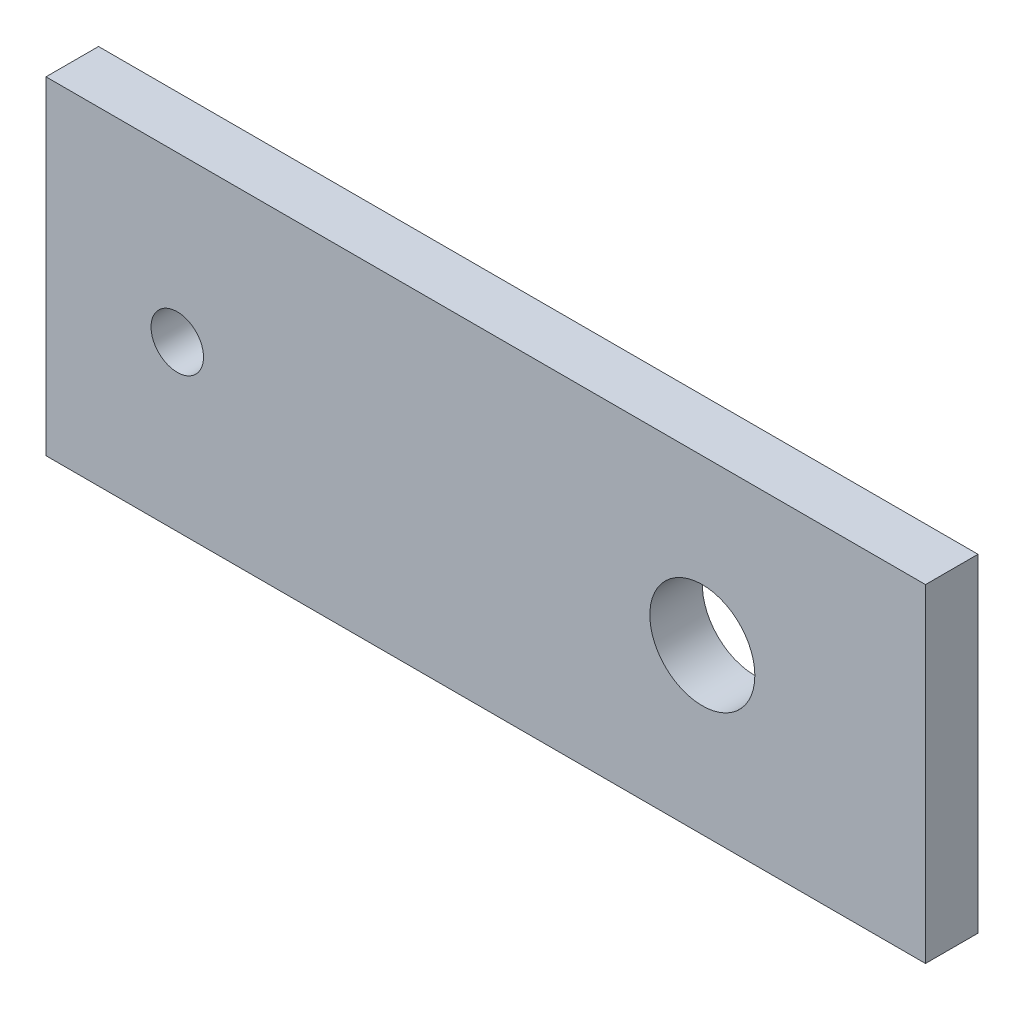
ISO-10303-21;
HEADER;
FILE_DESCRIPTION(('STEP AP214'),'2;1');
FILE_NAME('part.step','',(''),(''),'','','');
FILE_SCHEMA(('AUTOMOTIVE_DESIGN { 1 0 10303 214 1 1 1 1 }'));
ENDSEC;
DATA;
#1=APPLICATION_CONTEXT('core data for automotive mechanical design processes');
#2=APPLICATION_PROTOCOL_DEFINITION('international standard','automotive_design',2000,#1);
#3=PRODUCT_CONTEXT('',#1,'mechanical');
#4=PRODUCT('Part','Part','',(#3));
#5=PRODUCT_RELATED_PRODUCT_CATEGORY('part','',(#4));
#6=PRODUCT_DEFINITION_FORMATION('','',#4);
#7=PRODUCT_DEFINITION_CONTEXT('part definition',#1,'design');
#8=PRODUCT_DEFINITION('design','',#6,#7);
#9=PRODUCT_DEFINITION_SHAPE('','',#8);
#10=(LENGTH_UNIT() NAMED_UNIT(*) SI_UNIT(.MILLI.,.METRE.));
#11=(NAMED_UNIT(*) PLANE_ANGLE_UNIT() SI_UNIT($,.RADIAN.));
#12=(NAMED_UNIT(*) SI_UNIT($,.STERADIAN.) SOLID_ANGLE_UNIT());
#13=UNCERTAINTY_MEASURE_WITH_UNIT(LENGTH_MEASURE(1.E-05),#10,'distance_accuracy_value','');
#14=(GEOMETRIC_REPRESENTATION_CONTEXT(3) GLOBAL_UNCERTAINTY_ASSIGNED_CONTEXT((#13)) GLOBAL_UNIT_ASSIGNED_CONTEXT((#10,
#11,#12)) REPRESENTATION_CONTEXT('',''));
#15=CARTESIAN_POINT('',(0.,0.,0.));
#16=DIRECTION('',(0.,0.,1.));
#17=DIRECTION('',(1.,0.,0.));
#18=AXIS2_PLACEMENT_3D('',#15,#16,#17);
#19=CARTESIAN_POINT('',(-44.8440772899563,30.456602492762,4.));
#20=DIRECTION('',(1.,0.,0.));
#21=DIRECTION('',(0.,1.,0.));
#22=AXIS2_PLACEMENT_3D('',#19,#20,#21);
#23=PLANE('',#22);
#24=DIRECTION('',(0.,-1.,0.));
#25=VECTOR('',#24,1.);
#26=CARTESIAN_POINT('',(-44.8440772899563,30.456602492762,0.));
#27=LINE('',#26,#25);
#28=CARTESIAN_POINT('',(-44.8440772899563,30.456602492762,0.));
#29=VERTEX_POINT('',#28);
#30=CARTESIAN_POINT('',(-44.8440772899563,5.45660249276201,0.));
#31=VERTEX_POINT('',#30);
#32=EDGE_CURVE('E95',#29,#31,#27,.T.);
#33=ORIENTED_EDGE('',*,*,#32,.T.);
#34=DIRECTION('',(0.,0.,-1.));
#35=VECTOR('',#34,1.);
#36=CARTESIAN_POINT('',(-44.8440772899563,5.45660249276201,4.));
#37=LINE('',#36,#35);
#38=CARTESIAN_POINT('',(-44.8440772899563,5.45660249276201,4.));
#39=VERTEX_POINT('',#38);
#40=EDGE_CURVE('E11',#39,#31,#37,.T.);
#41=ORIENTED_EDGE('',*,*,#40,.F.);
#42=DIRECTION('',(0.,-1.,0.));
#43=VECTOR('',#42,1.);
#44=CARTESIAN_POINT('',(-44.8440772899563,30.456602492762,4.));
#45=LINE('',#44,#43);
#46=CARTESIAN_POINT('',(-44.8440772899563,30.456602492762,4.));
#47=VERTEX_POINT('',#46);
#48=EDGE_CURVE('E83',#47,#39,#45,.T.);
#49=ORIENTED_EDGE('',*,*,#48,.F.);
#50=DIRECTION('',(0.,0.,-1.));
#51=VECTOR('',#50,1.);
#52=CARTESIAN_POINT('',(-44.8440772899563,30.456602492762,4.));
#53=LINE('',#52,#51);
#54=EDGE_CURVE('E91',#47,#29,#53,.T.);
#55=ORIENTED_EDGE('',*,*,#54,.T.);
#56=EDGE_LOOP('',(#33,#41,#49,#55));
#57=FACE_BOUND('',#56,.T.);
#58=ADVANCED_FACE('F32',(#57),#23,.F.);
#59=CARTESIAN_POINT('',(-44.8440772899563,5.45660249276201,4.));
#60=DIRECTION('',(0.,1.,0.));
#61=DIRECTION('',(0.,0.,1.));
#62=AXIS2_PLACEMENT_3D('',#59,#60,#61);
#63=PLANE('',#62);
#64=DIRECTION('',(1.,0.,0.));
#65=VECTOR('',#64,1.);
#66=CARTESIAN_POINT('',(-44.8440772899563,5.45660249276201,0.));
#67=LINE('',#66,#65);
#68=CARTESIAN_POINT('',(22.1559227100437,5.45660249276201,0.));
#69=VERTEX_POINT('',#68);
#70=EDGE_CURVE('E87',#31,#69,#67,.T.);
#71=ORIENTED_EDGE('',*,*,#70,.T.);
#72=DIRECTION('',(0.,0.,-1.));
#73=VECTOR('',#72,1.);
#74=CARTESIAN_POINT('',(22.1559227100437,5.45660249276201,4.));
#75=LINE('',#74,#73);
#76=CARTESIAN_POINT('',(22.1559227100437,5.45660249276201,4.));
#77=VERTEX_POINT('',#76);
#78=EDGE_CURVE('E40',#77,#69,#75,.T.);
#79=ORIENTED_EDGE('',*,*,#78,.F.);
#80=DIRECTION('',(1.,0.,0.));
#81=VECTOR('',#80,1.);
#82=CARTESIAN_POINT('',(-44.8440772899563,5.45660249276201,4.));
#83=LINE('',#82,#81);
#84=EDGE_CURVE('E78',#39,#77,#83,.T.);
#85=ORIENTED_EDGE('',*,*,#84,.F.);
#86=ORIENTED_EDGE('',*,*,#40,.T.);
#87=EDGE_LOOP('',(#71,#79,#85,#86));
#88=FACE_BOUND('',#87,.T.);
#89=ADVANCED_FACE('F86',(#88),#63,.F.);
#90=CARTESIAN_POINT('',(22.1559227100437,30.456602492762,4.));
#91=DIRECTION('',(-1.,0.,0.));
#92=DIRECTION('',(0.,-1.,0.));
#93=AXIS2_PLACEMENT_3D('',#90,#91,#92);
#94=PLANE('',#93);
#95=DIRECTION('',(0.,1.,0.));
#96=VECTOR('',#95,1.);
#97=CARTESIAN_POINT('',(22.1559227100437,30.456602492762,0.));
#98=LINE('',#97,#96);
#99=CARTESIAN_POINT('',(22.1559227100437,30.456602492762,0.));
#100=VERTEX_POINT('',#99);
#101=EDGE_CURVE('E65',#69,#100,#98,.T.);
#102=ORIENTED_EDGE('',*,*,#101,.T.);
#103=DIRECTION('',(0.,0.,-1.));
#104=VECTOR('',#103,1.);
#105=CARTESIAN_POINT('',(22.1559227100437,30.456602492762,4.));
#106=LINE('',#105,#104);
#107=CARTESIAN_POINT('',(22.1559227100437,30.456602492762,4.));
#108=VERTEX_POINT('',#107);
#109=EDGE_CURVE('E88',#108,#100,#106,.T.);
#110=ORIENTED_EDGE('',*,*,#109,.F.);
#111=DIRECTION('',(0.,1.,0.));
#112=VECTOR('',#111,1.);
#113=CARTESIAN_POINT('',(22.1559227100437,30.456602492762,4.));
#114=LINE('',#113,#112);
#115=EDGE_CURVE('E81',#77,#108,#114,.T.);
#116=ORIENTED_EDGE('',*,*,#115,.F.);
#117=ORIENTED_EDGE('',*,*,#78,.T.);
#118=EDGE_LOOP('',(#102,#110,#116,#117));
#119=FACE_BOUND('',#118,.T.);
#120=ADVANCED_FACE('F89',(#119),#94,.F.);
#121=CARTESIAN_POINT('',(-44.8440772899563,30.456602492762,4.));
#122=DIRECTION('',(0.,-1.,0.));
#123=DIRECTION('',(0.,0.,-1.));
#124=AXIS2_PLACEMENT_3D('',#121,#122,#123);
#125=PLANE('',#124);
#126=DIRECTION('',(-1.,0.,0.));
#127=VECTOR('',#126,1.);
#128=CARTESIAN_POINT('',(-44.8440772899563,30.456602492762,0.));
#129=LINE('',#128,#127);
#130=EDGE_CURVE('E71',#100,#29,#129,.T.);
#131=ORIENTED_EDGE('',*,*,#130,.T.);
#132=ORIENTED_EDGE('',*,*,#54,.F.);
#133=DIRECTION('',(-1.,0.,0.));
#134=VECTOR('',#133,1.);
#135=CARTESIAN_POINT('',(-44.8440772899563,30.456602492762,4.));
#136=LINE('',#135,#134);
#137=EDGE_CURVE('E48',#108,#47,#136,.T.);
#138=ORIENTED_EDGE('',*,*,#137,.F.);
#139=ORIENTED_EDGE('',*,*,#109,.T.);
#140=EDGE_LOOP('',(#131,#132,#138,#139));
#141=FACE_BOUND('',#140,.T.);
#142=ADVANCED_FACE('F103',(#141),#125,.F.);
#143=CARTESIAN_POINT('',(-44.8440772899563,5.45660249276201,4.));
#144=DIRECTION('',(0.,0.,1.));
#145=DIRECTION('',(1.,0.,0.));
#146=AXIS2_PLACEMENT_3D('',#143,#144,#145);
#147=PLANE('',#146);
#148=CARTESIAN_POINT('',(5.15592271004368,17.956602492762,4.));
#149=DIRECTION('',(0.,0.,1.));
#150=DIRECTION('',(1.,0.,0.));
#151=AXIS2_PLACEMENT_3D('',#148,#149,#150);
#152=CIRCLE('',#151,4.);
#153=CARTESIAN_POINT('',(9.15592271004368,17.956602492762,4.));
#154=VERTEX_POINT('',#153);
#155=EDGE_CURVE('E115',#154,#154,#152,.T.);
#156=ORIENTED_EDGE('',*,*,#155,.F.);
#157=EDGE_LOOP('',(#156));
#158=FACE_BOUND('',#157,.T.);
#159=CARTESIAN_POINT('',(-34.8440772899563,17.956602492762,4.));
#160=DIRECTION('',(0.,0.,1.));
#161=DIRECTION('',(1.,0.,0.));
#162=AXIS2_PLACEMENT_3D('',#159,#160,#161);
#163=CIRCLE('',#162,2.);
#164=CARTESIAN_POINT('',(-32.8440772899563,17.956602492762,4.));
#165=VERTEX_POINT('',#164);
#166=EDGE_CURVE('E109',#165,#165,#163,.T.);
#167=ORIENTED_EDGE('',*,*,#166,.F.);
#168=EDGE_LOOP('',(#167));
#169=FACE_BOUND('',#168,.T.);
#170=ORIENTED_EDGE('',*,*,#48,.T.);
#171=ORIENTED_EDGE('',*,*,#84,.T.);
#172=ORIENTED_EDGE('',*,*,#115,.T.);
#173=ORIENTED_EDGE('',*,*,#137,.T.);
#174=EDGE_LOOP('',(#170,#171,#172,#173));
#175=FACE_BOUND('',#174,.T.);
#176=ADVANCED_FACE('F79',(#158,#169,#175),#147,.T.);
#177=CARTESIAN_POINT('',(-44.8440772899563,5.45660249276201,0.));
#178=DIRECTION('',(0.,0.,1.));
#179=DIRECTION('',(1.,0.,0.));
#180=AXIS2_PLACEMENT_3D('',#177,#178,#179);
#181=PLANE('',#180);
#182=CARTESIAN_POINT('',(5.15592271004368,17.956602492762,0.));
#183=DIRECTION('',(0.,0.,1.));
#184=DIRECTION('',(1.,0.,0.));
#185=AXIS2_PLACEMENT_3D('',#182,#183,#184);
#186=CIRCLE('',#185,4.);
#187=CARTESIAN_POINT('',(9.15592271004368,17.956602492762,0.));
#188=VERTEX_POINT('',#187);
#189=EDGE_CURVE('E112',#188,#188,#186,.T.);
#190=ORIENTED_EDGE('',*,*,#189,.T.);
#191=EDGE_LOOP('',(#190));
#192=FACE_BOUND('',#191,.T.);
#193=CARTESIAN_POINT('',(-34.8440772899563,17.956602492762,0.));
#194=DIRECTION('',(0.,0.,1.));
#195=DIRECTION('',(1.,0.,0.));
#196=AXIS2_PLACEMENT_3D('',#193,#194,#195);
#197=CIRCLE('',#196,2.);
#198=CARTESIAN_POINT('',(-32.8440772899563,17.956602492762,0.));
#199=VERTEX_POINT('',#198);
#200=EDGE_CURVE('E98',#199,#199,#197,.T.);
#201=ORIENTED_EDGE('',*,*,#200,.T.);
#202=EDGE_LOOP('',(#201));
#203=FACE_BOUND('',#202,.T.);
#204=ORIENTED_EDGE('',*,*,#32,.F.);
#205=ORIENTED_EDGE('',*,*,#130,.F.);
#206=ORIENTED_EDGE('',*,*,#101,.F.);
#207=ORIENTED_EDGE('',*,*,#70,.F.);
#208=EDGE_LOOP('',(#204,#205,#206,#207));
#209=FACE_BOUND('',#208,.T.);
#210=ADVANCED_FACE('F106',(#192,#203,#209),#181,.F.);
#211=CARTESIAN_POINT('',(-34.8440772899563,17.956602492762,0.));
#212=DIRECTION('',(0.,0.,1.));
#213=DIRECTION('',(1.,0.,0.));
#214=AXIS2_PLACEMENT_3D('',#211,#212,#213);
#215=CYLINDRICAL_SURFACE('',#214,2.);
#216=ORIENTED_EDGE('',*,*,#200,.F.);
#217=EDGE_LOOP('',(#216));
#218=FACE_BOUND('',#217,.T.);
#219=ORIENTED_EDGE('',*,*,#166,.T.);
#220=EDGE_LOOP('',(#219));
#221=FACE_BOUND('',#220,.T.);
#222=ADVANCED_FACE('F126',(#218,#221),#215,.F.);
#223=CARTESIAN_POINT('',(5.15592271004368,17.956602492762,0.));
#224=DIRECTION('',(0.,0.,1.));
#225=DIRECTION('',(1.,0.,0.));
#226=AXIS2_PLACEMENT_3D('',#223,#224,#225);
#227=CYLINDRICAL_SURFACE('',#226,4.);
#228=ORIENTED_EDGE('',*,*,#189,.F.);
#229=EDGE_LOOP('',(#228));
#230=FACE_BOUND('',#229,.T.);
#231=ORIENTED_EDGE('',*,*,#155,.T.);
#232=EDGE_LOOP('',(#231));
#233=FACE_BOUND('',#232,.T.);
#234=ADVANCED_FACE('F123',(#230,#233),#227,.F.);
#235=CLOSED_SHELL('',(#58,#89,#120,#142,#176,#210,#222,#234));
#236=MANIFOLD_SOLID_BREP('B2',#235);
#237=ADVANCED_BREP_SHAPE_REPRESENTATION('',(#18,#236),#14);
#238=SHAPE_DEFINITION_REPRESENTATION(#9,#237);
ENDSEC;
END-ISO-10303-21;
